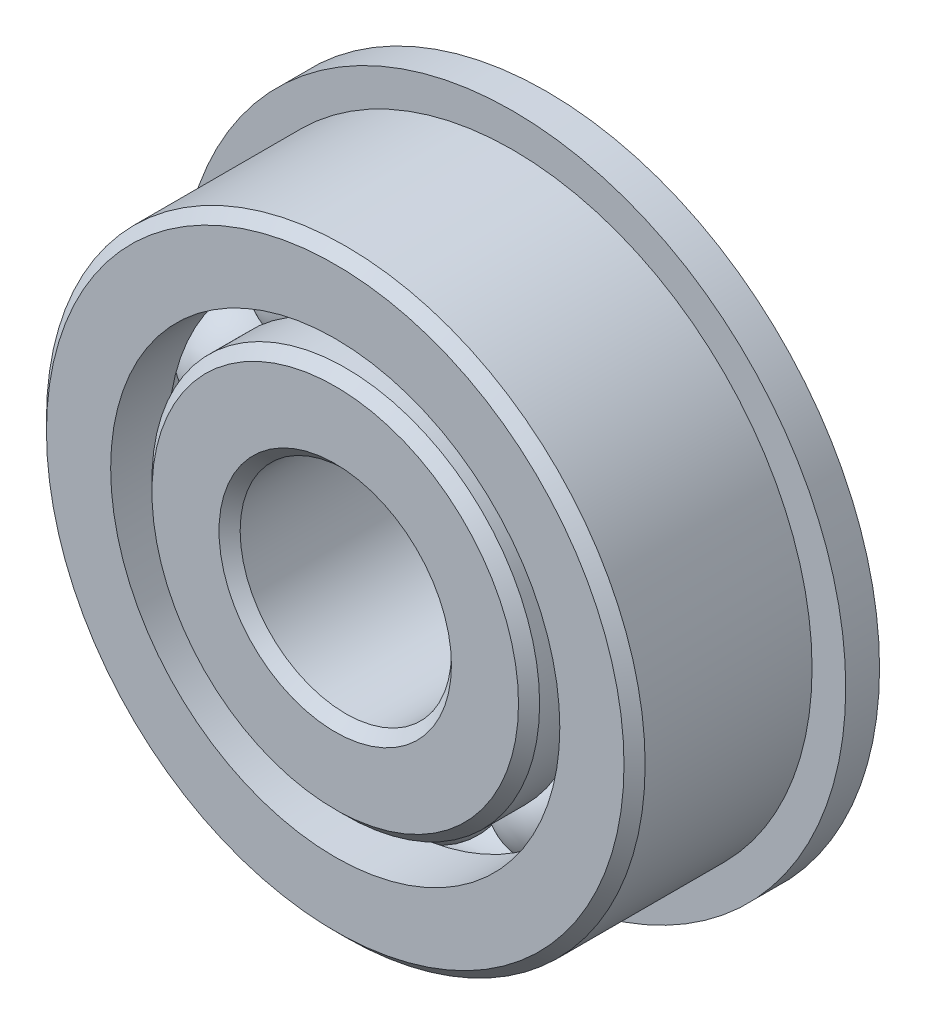
ISO-10303-21;
HEADER;
FILE_DESCRIPTION(('STEP AP214'),'2;1');
FILE_NAME('part.step','',(''),(''),'','','');
FILE_SCHEMA(('AUTOMOTIVE_DESIGN { 1 0 10303 214 1 1 1 1 }'));
ENDSEC;
DATA;
#1=APPLICATION_CONTEXT('core data for automotive mechanical design processes');
#2=APPLICATION_PROTOCOL_DEFINITION('international standard','automotive_design',2000,#1);
#3=PRODUCT_CONTEXT('',#1,'mechanical');
#4=PRODUCT('Part','Part','',(#3));
#5=PRODUCT_RELATED_PRODUCT_CATEGORY('part','',(#4));
#6=PRODUCT_DEFINITION_FORMATION('','',#4);
#7=PRODUCT_DEFINITION_CONTEXT('part definition',#1,'design');
#8=PRODUCT_DEFINITION('design','',#6,#7);
#9=PRODUCT_DEFINITION_SHAPE('','',#8);
#10=(LENGTH_UNIT() NAMED_UNIT(*) SI_UNIT(.MILLI.,.METRE.));
#11=(NAMED_UNIT(*) PLANE_ANGLE_UNIT() SI_UNIT($,.RADIAN.));
#12=(NAMED_UNIT(*) SI_UNIT($,.STERADIAN.) SOLID_ANGLE_UNIT());
#13=UNCERTAINTY_MEASURE_WITH_UNIT(LENGTH_MEASURE(1.E-05),#10,'distance_accuracy_value','');
#14=(GEOMETRIC_REPRESENTATION_CONTEXT(3) GLOBAL_UNCERTAINTY_ASSIGNED_CONTEXT((#13)) GLOBAL_UNIT_ASSIGNED_CONTEXT((#10,
#11,#12)) REPRESENTATION_CONTEXT('',''));
#15=CARTESIAN_POINT('',(0.,0.,0.));
#16=DIRECTION('',(0.,0.,1.));
#17=DIRECTION('',(1.,0.,0.));
#18=AXIS2_PLACEMENT_3D('',#15,#16,#17);
#19=CARTESIAN_POINT('',(-5.36537725608213,7.38480825177889,0.));
#20=DIRECTION('',(0.,0.,1.));
#21=DIRECTION('',(-0.587785252292462,0.809016994374955,0.));
#22=AXIS2_PLACEMENT_3D('',#19,#20,#21);
#23=SPHERICAL_SURFACE('',#22,2.38125);
#24=CARTESIAN_POINT('',(-5.36537725608213,7.38480825177889,2.38125));
#25=VERTEX_POINT('',#24);
#26=VERTEX_LOOP('',#25);
#27=FACE_BOUND('',#26,.T.);
#28=ADVANCED_FACE('F42',(#27),#23,.T.);
#29=CLOSED_SHELL('',(#28));
#30=MANIFOLD_SOLID_BREP('B2',#29);
#31=CARTESIAN_POINT('',(-8.68136276280667,2.82074575177892,0.));
#32=DIRECTION('',(0.,0.,1.));
#33=DIRECTION('',(-0.95105651629515,0.309016994374958,0.));
#34=AXIS2_PLACEMENT_3D('',#31,#32,#33);
#35=SPHERICAL_SURFACE('',#34,2.38125);
#36=CARTESIAN_POINT('',(-8.68136276280667,2.82074575177892,2.38125));
#37=VERTEX_POINT('',#36);
#38=VERTEX_LOOP('',#37);
#39=FACE_BOUND('',#38,.T.);
#40=ADVANCED_FACE('F65',(#39),#35,.T.);
#41=CLOSED_SHELL('',(#40));
#42=MANIFOLD_SOLID_BREP('B6',#41);
#43=CARTESIAN_POINT('',(-8.68136276280673,-2.82074575177873,0.));
#44=DIRECTION('',(0.,0.,1.));
#45=DIRECTION('',(-0.951056516295157,-0.309016994374938,0.));
#46=AXIS2_PLACEMENT_3D('',#43,#44,#45);
#47=SPHERICAL_SURFACE('',#46,2.38125);
#48=CARTESIAN_POINT('',(-8.68136276280673,-2.82074575177873,2.38125));
#49=VERTEX_POINT('',#48);
#50=VERTEX_LOOP('',#49);
#51=FACE_BOUND('',#50,.T.);
#52=ADVANCED_FACE('F86',(#51),#47,.T.);
#53=CLOSED_SHELL('',(#52));
#54=MANIFOLD_SOLID_BREP('B38',#53);
#55=CARTESIAN_POINT('',(-5.3653772560823,-7.38480825177877,0.));
#56=DIRECTION('',(0.,0.,1.));
#57=DIRECTION('',(-0.58778525229248,-0.809016994374942,0.));
#58=AXIS2_PLACEMENT_3D('',#55,#56,#57);
#59=SPHERICAL_SURFACE('',#58,2.38125);
#60=CARTESIAN_POINT('',(-5.3653772560823,-7.38480825177877,2.38125));
#61=VERTEX_POINT('',#60);
#62=VERTEX_LOOP('',#61);
#63=FACE_BOUND('',#62,.T.);
#64=ADVANCED_FACE('F110',(#63),#59,.T.);
#65=CLOSED_SHELL('',(#64));
#66=MANIFOLD_SOLID_BREP('B61',#65);
#67=CARTESIAN_POINT('',(0.,-9.128125,0.));
#68=DIRECTION('',(0.,0.,1.));
#69=DIRECTION('',(0.,-1.,0.));
#70=AXIS2_PLACEMENT_3D('',#67,#68,#69);
#71=SPHERICAL_SURFACE('',#70,2.38125);
#72=CARTESIAN_POINT('',(0.,-9.128125,2.38125));
#73=VERTEX_POINT('',#72);
#74=VERTEX_LOOP('',#73);
#75=FACE_BOUND('',#74,.T.);
#76=ADVANCED_FACE('F133',(#75),#71,.T.);
#77=CLOSED_SHELL('',(#76));
#78=MANIFOLD_SOLID_BREP('B82',#77);
#79=CARTESIAN_POINT('',(5.36537725608219,-7.38480825177885,0.));
#80=DIRECTION('',(0.,0.,1.));
#81=DIRECTION('',(0.587785252292469,-0.809016994374951,0.));
#82=AXIS2_PLACEMENT_3D('',#79,#80,#81);
#83=SPHERICAL_SURFACE('',#82,2.38125);
#84=CARTESIAN_POINT('',(5.36537725608219,-7.38480825177885,2.38125));
#85=VERTEX_POINT('',#84);
#86=VERTEX_LOOP('',#85);
#87=FACE_BOUND('',#86,.T.);
#88=ADVANCED_FACE('F153',(#87),#83,.T.);
#89=CLOSED_SHELL('',(#88));
#90=MANIFOLD_SOLID_BREP('B106',#89);
#91=CARTESIAN_POINT('',(8.68136276280669,-2.82074575177885,0.));
#92=DIRECTION('',(0.,0.,1.));
#93=DIRECTION('',(0.951056516295152,-0.309016994374952,0.));
#94=AXIS2_PLACEMENT_3D('',#91,#92,#93);
#95=SPHERICAL_SURFACE('',#94,2.38125);
#96=CARTESIAN_POINT('',(8.68136276280669,-2.82074575177885,2.38125));
#97=VERTEX_POINT('',#96);
#98=VERTEX_LOOP('',#97);
#99=FACE_BOUND('',#98,.T.);
#100=ADVANCED_FACE('F173',(#99),#95,.T.);
#101=CLOSED_SHELL('',(#100));
#102=MANIFOLD_SOLID_BREP('B129',#101);
#103=CARTESIAN_POINT('',(8.68136276280671,2.82074575177879,0.));
#104=DIRECTION('',(0.,0.,1.));
#105=DIRECTION('',(0.951056516295155,0.309016994374945,0.));
#106=AXIS2_PLACEMENT_3D('',#103,#104,#105);
#107=SPHERICAL_SURFACE('',#106,2.38125);
#108=CARTESIAN_POINT('',(8.68136276280671,2.82074575177879,2.38125));
#109=VERTEX_POINT('',#108);
#110=VERTEX_LOOP('',#109);
#111=FACE_BOUND('',#110,.T.);
#112=ADVANCED_FACE('F193',(#111),#107,.T.);
#113=CLOSED_SHELL('',(#112));
#114=MANIFOLD_SOLID_BREP('B149',#113);
#115=CARTESIAN_POINT('',(5.36537725608224,7.38480825177881,0.));
#116=DIRECTION('',(0.,0.,1.));
#117=DIRECTION('',(0.587785252292474,0.809016994374947,0.));
#118=AXIS2_PLACEMENT_3D('',#115,#116,#117);
#119=SPHERICAL_SURFACE('',#118,2.38125);
#120=CARTESIAN_POINT('',(5.36537725608224,7.38480825177881,2.38125));
#121=VERTEX_POINT('',#120);
#122=VERTEX_LOOP('',#121);
#123=FACE_BOUND('',#122,.T.);
#124=ADVANCED_FACE('F213',(#123),#119,.T.);
#125=CLOSED_SHELL('',(#124));
#126=MANIFOLD_SOLID_BREP('B169',#125);
#127=CARTESIAN_POINT('',(0.,9.128125,0.));
#128=DIRECTION('',(0.,0.,1.));
#129=DIRECTION('',(0.,1.,0.));
#130=AXIS2_PLACEMENT_3D('',#127,#128,#129);
#131=SPHERICAL_SURFACE('',#130,2.38125);
#132=CARTESIAN_POINT('',(0.,9.128125,2.38125));
#133=VERTEX_POINT('',#132);
#134=VERTEX_LOOP('',#133);
#135=FACE_BOUND('',#134,.T.);
#136=ADVANCED_FACE('F237',(#135),#131,.T.);
#137=CLOSED_SHELL('',(#136));
#138=MANIFOLD_SOLID_BREP('B189',#137);
#139=CARTESIAN_POINT('',(0.,0.,4.28625));
#140=DIRECTION('',(0.,0.,-1.));
#141=DIRECTION('',(-1.,0.,0.));
#142=AXIS2_PLACEMENT_3D('',#139,#140,#141);
#143=CONICAL_SURFACE('',#142,8.7376,0.785398163397447);
#144=CARTESIAN_POINT('',(0.,0.,4.7625));
#145=DIRECTION('',(0.,0.,1.));
#146=DIRECTION('',(1.,0.,0.));
#147=AXIS2_PLACEMENT_3D('',#144,#145,#146);
#148=CIRCLE('',#147,8.26135);
#149=CARTESIAN_POINT('',(8.26135,0.,4.7625));
#150=VERTEX_POINT('',#149);
#151=EDGE_CURVE('E236',#150,#150,#148,.T.);
#152=ORIENTED_EDGE('',*,*,#151,.F.);
#153=EDGE_LOOP('',(#152));
#154=FACE_BOUND('',#153,.T.);
#155=CARTESIAN_POINT('',(0.,0.,4.28625));
#156=DIRECTION('',(0.,0.,1.));
#157=DIRECTION('',(1.,0.,0.));
#158=AXIS2_PLACEMENT_3D('',#155,#156,#157);
#159=CIRCLE('',#158,8.7376);
#160=CARTESIAN_POINT('',(8.7376,0.,4.28625));
#161=VERTEX_POINT('',#160);
#162=EDGE_CURVE('E298',#161,#161,#159,.T.);
#163=ORIENTED_EDGE('',*,*,#162,.T.);
#164=EDGE_LOOP('',(#163));
#165=FACE_BOUND('',#164,.T.);
#166=ADVANCED_FACE('F264',(#154,#165),#143,.T.);
#167=CARTESIAN_POINT('',(0.,5.23875,4.7625));
#168=DIRECTION('',(0.,0.,-1.));
#169=DIRECTION('',(-1.,0.,0.));
#170=AXIS2_PLACEMENT_3D('',#167,#168,#169);
#171=PLANE('',#170);
#172=CARTESIAN_POINT('',(0.,0.,4.7625));
#173=DIRECTION('',(0.,0.,1.));
#174=DIRECTION('',(1.,0.,0.));
#175=AXIS2_PLACEMENT_3D('',#172,#173,#174);
#176=CIRCLE('',#175,5.23875);
#177=CARTESIAN_POINT('',(5.23875,0.,4.7625));
#178=VERTEX_POINT('',#177);
#179=EDGE_CURVE('E270',#178,#178,#176,.T.);
#180=ORIENTED_EDGE('',*,*,#179,.F.);
#181=EDGE_LOOP('',(#180));
#182=FACE_BOUND('',#181,.T.);
#183=ORIENTED_EDGE('',*,*,#151,.T.);
#184=EDGE_LOOP('',(#183));
#185=FACE_BOUND('',#184,.T.);
#186=ADVANCED_FACE('F347',(#182,#185),#171,.F.);
#187=CARTESIAN_POINT('',(0.,0.,4.7625));
#188=DIRECTION('',(0.,0.,1.));
#189=DIRECTION('',(1.,0.,0.));
#190=AXIS2_PLACEMENT_3D('',#187,#188,#189);
#191=CONICAL_SURFACE('',#190,5.23875,0.785398163397449);
#192=CARTESIAN_POINT('',(0.,0.,4.28625));
#193=DIRECTION('',(0.,0.,1.));
#194=DIRECTION('',(1.,0.,0.));
#195=AXIS2_PLACEMENT_3D('',#192,#193,#194);
#196=CIRCLE('',#195,4.7625);
#197=CARTESIAN_POINT('',(4.7625,0.,4.28625));
#198=VERTEX_POINT('',#197);
#199=EDGE_CURVE('E274',#198,#198,#196,.T.);
#200=ORIENTED_EDGE('',*,*,#199,.F.);
#201=EDGE_LOOP('',(#200));
#202=FACE_BOUND('',#201,.T.);
#203=ORIENTED_EDGE('',*,*,#179,.T.);
#204=EDGE_LOOP('',(#203));
#205=FACE_BOUND('',#204,.T.);
#206=ADVANCED_FACE('F342',(#202,#205),#191,.F.);
#207=CARTESIAN_POINT('',(0.,0.,4.7625));
#208=DIRECTION('',(0.,0.,1.));
#209=DIRECTION('',(1.,0.,0.));
#210=AXIS2_PLACEMENT_3D('',#207,#208,#209);
#211=CYLINDRICAL_SURFACE('',#210,4.7625);
#212=CARTESIAN_POINT('',(0.,0.,-5.88645));
#213=DIRECTION('',(0.,0.,1.));
#214=DIRECTION('',(1.,0.,0.));
#215=AXIS2_PLACEMENT_3D('',#212,#213,#214);
#216=CIRCLE('',#215,4.7625);
#217=CARTESIAN_POINT('',(4.7625,0.,-5.88645));
#218=VERTEX_POINT('',#217);
#219=EDGE_CURVE('E278',#218,#218,#216,.T.);
#220=ORIENTED_EDGE('',*,*,#219,.F.);
#221=EDGE_LOOP('',(#220));
#222=FACE_BOUND('',#221,.T.);
#223=ORIENTED_EDGE('',*,*,#199,.T.);
#224=EDGE_LOOP('',(#223));
#225=FACE_BOUND('',#224,.T.);
#226=ADVANCED_FACE('F336',(#222,#225),#211,.F.);
#227=CARTESIAN_POINT('',(0.,0.,-5.88645));
#228=DIRECTION('',(0.,0.,-1.));
#229=DIRECTION('',(-1.,0.,0.));
#230=AXIS2_PLACEMENT_3D('',#227,#228,#229);
#231=CONICAL_SURFACE('',#230,4.7625,0.785398163397448);
#232=CARTESIAN_POINT('',(0.,0.,-6.3627));
#233=DIRECTION('',(0.,0.,1.));
#234=DIRECTION('',(1.,0.,0.));
#235=AXIS2_PLACEMENT_3D('',#232,#233,#234);
#236=CIRCLE('',#235,5.23875);
#237=CARTESIAN_POINT('',(5.23875,0.,-6.3627));
#238=VERTEX_POINT('',#237);
#239=EDGE_CURVE('E283',#238,#238,#236,.T.);
#240=ORIENTED_EDGE('',*,*,#239,.F.);
#241=EDGE_LOOP('',(#240));
#242=FACE_BOUND('',#241,.T.);
#243=ORIENTED_EDGE('',*,*,#219,.T.);
#244=EDGE_LOOP('',(#243));
#245=FACE_BOUND('',#244,.T.);
#246=ADVANCED_FACE('F330',(#242,#245),#231,.F.);
#247=CARTESIAN_POINT('',(0.,8.26135,-6.3627));
#248=DIRECTION('',(0.,0.,1.));
#249=DIRECTION('',(1.,0.,0.));
#250=AXIS2_PLACEMENT_3D('',#247,#248,#249);
#251=PLANE('',#250);
#252=CARTESIAN_POINT('',(0.,0.,-6.3627));
#253=DIRECTION('',(0.,0.,1.));
#254=DIRECTION('',(1.,0.,0.));
#255=AXIS2_PLACEMENT_3D('',#252,#253,#254);
#256=CIRCLE('',#255,8.26135);
#257=CARTESIAN_POINT('',(8.26135,0.,-6.3627));
#258=VERTEX_POINT('',#257);
#259=EDGE_CURVE('E286',#258,#258,#256,.T.);
#260=ORIENTED_EDGE('',*,*,#259,.F.);
#261=EDGE_LOOP('',(#260));
#262=FACE_BOUND('',#261,.T.);
#263=ORIENTED_EDGE('',*,*,#239,.T.);
#264=EDGE_LOOP('',(#263));
#265=FACE_BOUND('',#264,.T.);
#266=ADVANCED_FACE('F324',(#262,#265),#251,.F.);
#267=CARTESIAN_POINT('',(0.,0.,-6.3627));
#268=DIRECTION('',(0.,0.,1.));
#269=DIRECTION('',(1.,0.,0.));
#270=AXIS2_PLACEMENT_3D('',#267,#268,#269);
#271=CONICAL_SURFACE('',#270,8.26135,0.785398163397441);
#272=CARTESIAN_POINT('',(0.,0.,-5.88645));
#273=DIRECTION('',(0.,0.,1.));
#274=DIRECTION('',(1.,0.,0.));
#275=AXIS2_PLACEMENT_3D('',#272,#273,#274);
#276=CIRCLE('',#275,8.7376);
#277=CARTESIAN_POINT('',(8.7376,0.,-5.88645));
#278=VERTEX_POINT('',#277);
#279=EDGE_CURVE('E289',#278,#278,#276,.T.);
#280=ORIENTED_EDGE('',*,*,#279,.F.);
#281=EDGE_LOOP('',(#280));
#282=FACE_BOUND('',#281,.T.);
#283=ORIENTED_EDGE('',*,*,#259,.T.);
#284=EDGE_LOOP('',(#283));
#285=FACE_BOUND('',#284,.T.);
#286=ADVANCED_FACE('F318',(#282,#285),#271,.T.);
#287=CARTESIAN_POINT('',(0.,0.,4.7625));
#288=DIRECTION('',(0.,0.,1.));
#289=DIRECTION('',(1.,0.,0.));
#290=AXIS2_PLACEMENT_3D('',#287,#288,#289);
#291=CYLINDRICAL_SURFACE('',#290,8.7376);
#292=CARTESIAN_POINT('',(0.,0.,-2.34900868173683));
#293=DIRECTION('',(0.,0.,1.));
#294=DIRECTION('',(1.,0.,0.));
#295=AXIS2_PLACEMENT_3D('',#292,#293,#294);
#296=CIRCLE('',#295,8.7376);
#297=CARTESIAN_POINT('',(8.7376,0.,-2.34900868173683));
#298=VERTEX_POINT('',#297);
#299=EDGE_CURVE('E292',#298,#298,#296,.T.);
#300=ORIENTED_EDGE('',*,*,#299,.F.);
#301=EDGE_LOOP('',(#300));
#302=FACE_BOUND('',#301,.T.);
#303=ORIENTED_EDGE('',*,*,#279,.T.);
#304=EDGE_LOOP('',(#303));
#305=FACE_BOUND('',#304,.T.);
#306=ADVANCED_FACE('F312',(#302,#305),#291,.T.);
#307=CARTESIAN_POINT('',(0.,0.,0.));
#308=DIRECTION('',(0.,0.,1.));
#309=DIRECTION('',(1.,0.,0.));
#310=AXIS2_PLACEMENT_3D('',#307,#308,#309);
#311=TOROIDAL_SURFACE('',#310,9.128125,2.38125);
#312=CARTESIAN_POINT('',(0.,0.,2.34900868173683));
#313=DIRECTION('',(0.,0.,1.));
#314=DIRECTION('',(1.,0.,0.));
#315=AXIS2_PLACEMENT_3D('',#312,#313,#314);
#316=CIRCLE('',#315,8.7376);
#317=CARTESIAN_POINT('',(8.7376,0.,2.34900868173683));
#318=VERTEX_POINT('',#317);
#319=EDGE_CURVE('E295',#318,#318,#316,.T.);
#320=ORIENTED_EDGE('',*,*,#319,.F.);
#321=EDGE_LOOP('',(#320));
#322=FACE_BOUND('',#321,.T.);
#323=ORIENTED_EDGE('',*,*,#299,.T.);
#324=EDGE_LOOP('',(#323));
#325=FACE_BOUND('',#324,.T.);
#326=ADVANCED_FACE('F306',(#322,#325),#311,.F.);
#327=CARTESIAN_POINT('',(0.,0.,4.7625));
#328=DIRECTION('',(0.,0.,1.));
#329=DIRECTION('',(1.,0.,0.));
#330=AXIS2_PLACEMENT_3D('',#327,#328,#329);
#331=CYLINDRICAL_SURFACE('',#330,8.7376);
#332=ORIENTED_EDGE('',*,*,#162,.F.);
#333=EDGE_LOOP('',(#332));
#334=FACE_BOUND('',#333,.T.);
#335=ORIENTED_EDGE('',*,*,#319,.T.);
#336=EDGE_LOOP('',(#335));
#337=FACE_BOUND('',#336,.T.);
#338=ADVANCED_FACE('F303',(#334,#337),#331,.T.);
#339=CLOSED_SHELL('',(#166,#186,#206,#226,#246,#266,#286,#306,#326,#338));
#340=MANIFOLD_SOLID_BREP('B209',#339);
#341=CARTESIAN_POINT('',(0.,0.,4.28625));
#342=DIRECTION('',(0.,0.,-1.));
#343=DIRECTION('',(-1.,0.,0.));
#344=AXIS2_PLACEMENT_3D('',#341,#342,#343);
#345=CONICAL_SURFACE('',#344,13.49375,0.785398163397446);
#346=CARTESIAN_POINT('',(0.,0.,4.7625));
#347=DIRECTION('',(0.,0.,1.));
#348=DIRECTION('',(1.,0.,0.));
#349=AXIS2_PLACEMENT_3D('',#346,#347,#348);
#350=CIRCLE('',#349,13.0175);
#351=CARTESIAN_POINT('',(13.0175,0.,4.7625));
#352=VERTEX_POINT('',#351);
#353=EDGE_CURVE('E443',#352,#352,#350,.T.);
#354=ORIENTED_EDGE('',*,*,#353,.F.);
#355=EDGE_LOOP('',(#354));
#356=FACE_BOUND('',#355,.T.);
#357=CARTESIAN_POINT('',(0.,0.,4.28625));
#358=DIRECTION('',(0.,0.,1.));
#359=DIRECTION('',(1.,0.,0.));
#360=AXIS2_PLACEMENT_3D('',#357,#358,#359);
#361=CIRCLE('',#360,13.49375);
#362=CARTESIAN_POINT('',(13.49375,0.,4.28625));
#363=VERTEX_POINT('',#362);
#364=EDGE_CURVE('E263',#363,#363,#361,.T.);
#365=ORIENTED_EDGE('',*,*,#364,.T.);
#366=EDGE_LOOP('',(#365));
#367=FACE_BOUND('',#366,.T.);
#368=ADVANCED_FACE('F421',(#356,#367),#345,.T.);
#369=CARTESIAN_POINT('',(0.,0.,4.7625));
#370=DIRECTION('',(0.,0.,1.));
#371=DIRECTION('',(1.,0.,0.));
#372=AXIS2_PLACEMENT_3D('',#369,#370,#371);
#373=CYLINDRICAL_SURFACE('',#372,13.49375);
#374=CARTESIAN_POINT('',(0.,0.,-3.2385));
#375=DIRECTION('',(0.,0.,1.));
#376=DIRECTION('',(1.,0.,0.));
#377=AXIS2_PLACEMENT_3D('',#374,#375,#376);
#378=CIRCLE('',#377,13.49375);
#379=CARTESIAN_POINT('',(13.49375,0.,-3.2385));
#380=VERTEX_POINT('',#379);
#381=EDGE_CURVE('E446',#380,#380,#378,.T.);
#382=ORIENTED_EDGE('',*,*,#381,.T.);
#383=EDGE_LOOP('',(#382));
#384=FACE_BOUND('',#383,.T.);
#385=ORIENTED_EDGE('',*,*,#364,.F.);
#386=EDGE_LOOP('',(#385));
#387=FACE_BOUND('',#386,.T.);
#388=ADVANCED_FACE('F466',(#384,#387),#373,.T.);
#389=CARTESIAN_POINT('',(0.,13.0175,-4.7625));
#390=DIRECTION('',(0.,0.,1.));
#391=DIRECTION('',(1.,0.,0.));
#392=AXIS2_PLACEMENT_3D('',#389,#390,#391);
#393=PLANE('',#392);
#394=CARTESIAN_POINT('',(0.,0.,-4.7625));
#395=DIRECTION('',(0.,0.,1.));
#396=DIRECTION('',(1.,0.,0.));
#397=AXIS2_PLACEMENT_3D('',#394,#395,#396);
#398=CIRCLE('',#397,10.1234875);
#399=CARTESIAN_POINT('',(10.1234875,0.,-4.7625));
#400=VERTEX_POINT('',#399);
#401=EDGE_CURVE('E427',#400,#400,#398,.T.);
#402=ORIENTED_EDGE('',*,*,#401,.T.);
#403=EDGE_LOOP('',(#402));
#404=FACE_BOUND('',#403,.T.);
#405=CARTESIAN_POINT('',(0.,0.,-4.7625));
#406=DIRECTION('',(0.,0.,-1.));
#407=DIRECTION('',(-1.,0.,0.));
#408=AXIS2_PLACEMENT_3D('',#405,#406,#407);
#409=CIRCLE('',#408,15.0114);
#410=CARTESIAN_POINT('',(-15.0114,0.,-4.7625));
#411=VERTEX_POINT('',#410);
#412=EDGE_CURVE('E449',#411,#411,#409,.T.);
#413=ORIENTED_EDGE('',*,*,#412,.T.);
#414=EDGE_LOOP('',(#413));
#415=FACE_BOUND('',#414,.T.);
#416=ADVANCED_FACE('F469',(#404,#415),#393,.F.);
#417=CARTESIAN_POINT('',(0.,0.,4.7625));
#418=DIRECTION('',(0.,0.,1.));
#419=DIRECTION('',(1.,0.,0.));
#420=AXIS2_PLACEMENT_3D('',#417,#418,#419);
#421=CYLINDRICAL_SURFACE('',#420,10.1234875);
#422=CARTESIAN_POINT('',(0.,0.,-2.16323948190989));
#423=DIRECTION('',(0.,0.,1.));
#424=DIRECTION('',(1.,0.,0.));
#425=AXIS2_PLACEMENT_3D('',#422,#423,#424);
#426=CIRCLE('',#425,10.1234875);
#427=CARTESIAN_POINT('',(10.1234875,0.,-2.16323948190989));
#428=VERTEX_POINT('',#427);
#429=EDGE_CURVE('E431',#428,#428,#426,.T.);
#430=ORIENTED_EDGE('',*,*,#429,.T.);
#431=EDGE_LOOP('',(#430));
#432=FACE_BOUND('',#431,.T.);
#433=ORIENTED_EDGE('',*,*,#401,.F.);
#434=EDGE_LOOP('',(#433));
#435=FACE_BOUND('',#434,.T.);
#436=ADVANCED_FACE('F474',(#432,#435),#421,.F.);
#437=CARTESIAN_POINT('',(0.,0.,0.));
#438=DIRECTION('',(0.,0.,1.));
#439=DIRECTION('',(1.,0.,0.));
#440=AXIS2_PLACEMENT_3D('',#437,#438,#439);
#441=TOROIDAL_SURFACE('',#440,9.128125,2.38125);
#442=ORIENTED_EDGE('',*,*,#429,.F.);
#443=EDGE_LOOP('',(#442));
#444=FACE_BOUND('',#443,.T.);
#445=CARTESIAN_POINT('',(0.,0.,2.16323948190989));
#446=DIRECTION('',(0.,0.,1.));
#447=DIRECTION('',(1.,0.,0.));
#448=AXIS2_PLACEMENT_3D('',#445,#446,#447);
#449=CIRCLE('',#448,10.1234875);
#450=CARTESIAN_POINT('',(10.1234875,0.,2.16323948190989));
#451=VERTEX_POINT('',#450);
#452=EDGE_CURVE('E435',#451,#451,#449,.T.);
#453=ORIENTED_EDGE('',*,*,#452,.T.);
#454=EDGE_LOOP('',(#453));
#455=FACE_BOUND('',#454,.T.);
#456=ADVANCED_FACE('F480',(#444,#455),#441,.F.);
#457=CARTESIAN_POINT('',(0.,0.,4.7625));
#458=DIRECTION('',(0.,0.,1.));
#459=DIRECTION('',(1.,0.,0.));
#460=AXIS2_PLACEMENT_3D('',#457,#458,#459);
#461=CYLINDRICAL_SURFACE('',#460,10.1234875);
#462=ORIENTED_EDGE('',*,*,#452,.F.);
#463=EDGE_LOOP('',(#462));
#464=FACE_BOUND('',#463,.T.);
#465=CARTESIAN_POINT('',(0.,0.,4.7625));
#466=DIRECTION('',(0.,0.,1.));
#467=DIRECTION('',(1.,0.,0.));
#468=AXIS2_PLACEMENT_3D('',#465,#466,#467);
#469=CIRCLE('',#468,10.1234875);
#470=CARTESIAN_POINT('',(10.1234875,0.,4.7625));
#471=VERTEX_POINT('',#470);
#472=EDGE_CURVE('E440',#471,#471,#469,.T.);
#473=ORIENTED_EDGE('',*,*,#472,.T.);
#474=EDGE_LOOP('',(#473));
#475=FACE_BOUND('',#474,.T.);
#476=ADVANCED_FACE('F484',(#464,#475),#461,.F.);
#477=CARTESIAN_POINT('',(0.,13.0175,4.7625));
#478=DIRECTION('',(0.,0.,-1.));
#479=DIRECTION('',(-1.,0.,0.));
#480=AXIS2_PLACEMENT_3D('',#477,#478,#479);
#481=PLANE('',#480);
#482=ORIENTED_EDGE('',*,*,#472,.F.);
#483=EDGE_LOOP('',(#482));
#484=FACE_BOUND('',#483,.T.);
#485=ORIENTED_EDGE('',*,*,#353,.T.);
#486=EDGE_LOOP('',(#485));
#487=FACE_BOUND('',#486,.T.);
#488=ADVANCED_FACE('F462',(#484,#487),#481,.F.);
#489=CARTESIAN_POINT('',(0.,10.1234875,-3.2385));
#490=DIRECTION('',(0.,0.,1.));
#491=DIRECTION('',(1.,0.,0.));
#492=AXIS2_PLACEMENT_3D('',#489,#490,#491);
#493=PLANE('',#492);
#494=CARTESIAN_POINT('',(0.,0.,-3.2385));
#495=DIRECTION('',(0.,0.,-1.));
#496=DIRECTION('',(-1.,0.,0.));
#497=AXIS2_PLACEMENT_3D('',#494,#495,#496);
#498=CIRCLE('',#497,15.0114);
#499=CARTESIAN_POINT('',(-15.0114,0.,-3.2385));
#500=VERTEX_POINT('',#499);
#501=EDGE_CURVE('E452',#500,#500,#498,.T.);
#502=ORIENTED_EDGE('',*,*,#501,.F.);
#503=EDGE_LOOP('',(#502));
#504=FACE_BOUND('',#503,.T.);
#505=ORIENTED_EDGE('',*,*,#381,.F.);
#506=EDGE_LOOP('',(#505));
#507=FACE_BOUND('',#506,.T.);
#508=ADVANCED_FACE('F459',(#504,#507),#493,.T.);
#509=CARTESIAN_POINT('',(0.,0.,-4.7625));
#510=DIRECTION('',(0.,0.,-1.));
#511=DIRECTION('',(-1.,0.,0.));
#512=AXIS2_PLACEMENT_3D('',#509,#510,#511);
#513=CYLINDRICAL_SURFACE('',#512,15.0114);
#514=ORIENTED_EDGE('',*,*,#501,.T.);
#515=EDGE_LOOP('',(#514));
#516=FACE_BOUND('',#515,.T.);
#517=ORIENTED_EDGE('',*,*,#412,.F.);
#518=EDGE_LOOP('',(#517));
#519=FACE_BOUND('',#518,.T.);
#520=ADVANCED_FACE('F456',(#516,#519),#513,.T.);
#521=CLOSED_SHELL('',(#368,#388,#416,#436,#456,#476,#488,#508,#520));
#522=MANIFOLD_SOLID_BREP('B231',#521);
#523=ADVANCED_BREP_SHAPE_REPRESENTATION('',(#18,#30,#42,#54,#66,#78,#90,#102,#114,#126,#138,
#340,#522),#14);
#524=SHAPE_DEFINITION_REPRESENTATION(#9,#523);
ENDSEC;
END-ISO-10303-21;
